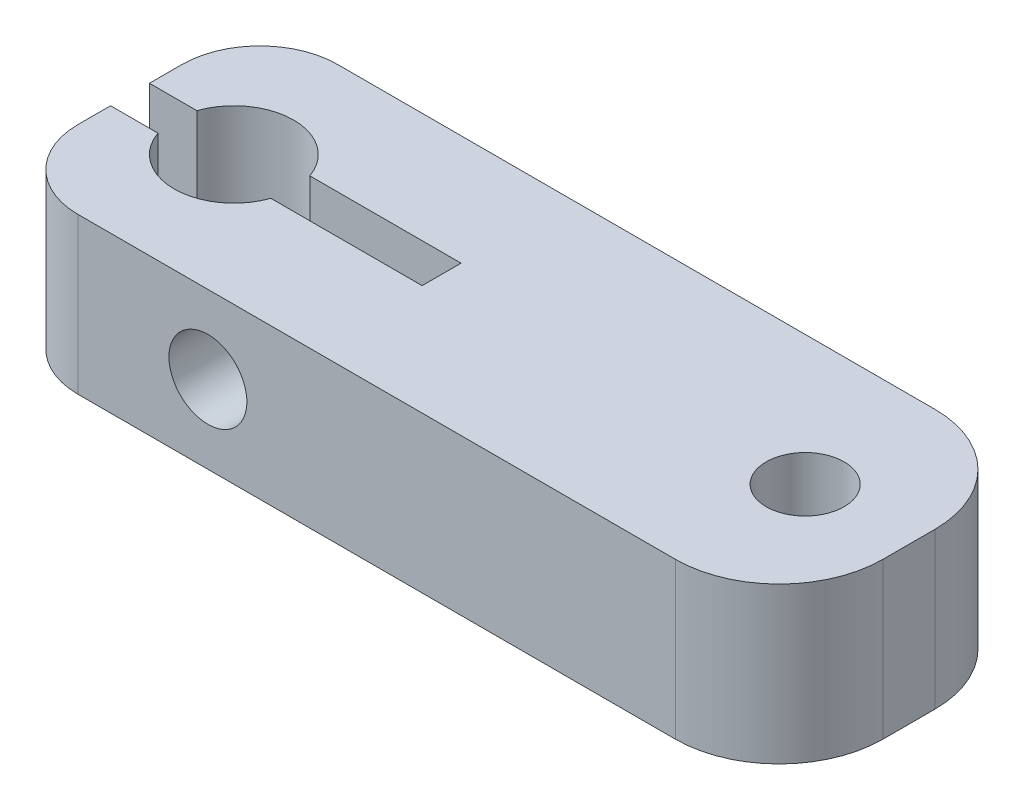
ISO-10303-21;
HEADER;
FILE_DESCRIPTION(('STEP AP214'),'2;1');
FILE_NAME('part.step','',(''),(''),'','','');
FILE_SCHEMA(('AUTOMOTIVE_DESIGN { 1 0 10303 214 1 1 1 1 }'));
ENDSEC;
DATA;
#1=APPLICATION_CONTEXT('core data for automotive mechanical design processes');
#2=APPLICATION_PROTOCOL_DEFINITION('international standard','automotive_design',2000,#1);
#3=PRODUCT_CONTEXT('',#1,'mechanical');
#4=PRODUCT('Part','Part','',(#3));
#5=PRODUCT_RELATED_PRODUCT_CATEGORY('part','',(#4));
#6=PRODUCT_DEFINITION_FORMATION('','',#4);
#7=PRODUCT_DEFINITION_CONTEXT('part definition',#1,'design');
#8=PRODUCT_DEFINITION('design','',#6,#7);
#9=PRODUCT_DEFINITION_SHAPE('','',#8);
#10=(LENGTH_UNIT() NAMED_UNIT(*) SI_UNIT(.MILLI.,.METRE.));
#11=(NAMED_UNIT(*) PLANE_ANGLE_UNIT() SI_UNIT($,.RADIAN.));
#12=(NAMED_UNIT(*) SI_UNIT($,.STERADIAN.) SOLID_ANGLE_UNIT());
#13=UNCERTAINTY_MEASURE_WITH_UNIT(LENGTH_MEASURE(1.E-05),#10,'distance_accuracy_value','');
#14=(GEOMETRIC_REPRESENTATION_CONTEXT(3) GLOBAL_UNCERTAINTY_ASSIGNED_CONTEXT((#13)) GLOBAL_UNIT_ASSIGNED_CONTEXT((#10,
#11,#12)) REPRESENTATION_CONTEXT('',''));
#15=CARTESIAN_POINT('',(0.,0.,0.));
#16=DIRECTION('',(0.,0.,1.));
#17=DIRECTION('',(1.,0.,0.));
#18=AXIS2_PLACEMENT_3D('',#15,#16,#17);
#19=CARTESIAN_POINT('',(-4.01717079102174,3.,-7.30912329358011));
#20=DIRECTION('',(0.,0.,-1.));
#21=DIRECTION('',(-1.,0.,0.));
#22=AXIS2_PLACEMENT_3D('',#19,#20,#21);
#23=CYLINDRICAL_SURFACE('',#22,1.5);
#24=CARTESIAN_POINT('',(-4.01717079102174,3.,-11.5601232935801));
#25=DIRECTION('',(0.,0.,1.));
#26=DIRECTION('',(1.,0.,0.));
#27=AXIS2_PLACEMENT_3D('',#24,#25,#26);
#28=CIRCLE('',#27,1.5);
#29=CARTESIAN_POINT('',(-2.51717079102175,3.,-11.5601232935801));
#30=VERTEX_POINT('',#29);
#31=EDGE_CURVE('E165',#30,#30,#28,.T.);
#32=ORIENTED_EDGE('',*,*,#31,.F.);
#33=EDGE_LOOP('',(#32));
#34=FACE_BOUND('',#33,.T.);
#35=CARTESIAN_POINT('',(-4.01717079102174,3.,-7.31012329358011));
#36=DIRECTION('',(0.,0.,-1.));
#37=DIRECTION('',(-1.,0.,0.));
#38=AXIS2_PLACEMENT_3D('',#35,#36,#37);
#39=CIRCLE('',#38,1.5);
#40=CARTESIAN_POINT('',(-5.51717079102174,3.,-7.31012329358011));
#41=VERTEX_POINT('',#40);
#42=EDGE_CURVE('E309',#41,#41,#39,.F.);
#43=ORIENTED_EDGE('',*,*,#42,.T.);
#44=EDGE_LOOP('',(#43));
#45=FACE_BOUND('',#44,.T.);
#46=ADVANCED_FACE('F41',(#34,#45),#23,.F.);
#47=CARTESIAN_POINT('',(-12.0171707910217,6.,-17.3101232935801));
#48=DIRECTION('',(1.,0.,0.));
#49=DIRECTION('',(0.,0.,-1.));
#50=AXIS2_PLACEMENT_3D('',#47,#48,#49);
#51=PLANE('',#50);
#52=DIRECTION('',(0.,0.,1.));
#53=VECTOR('',#52,1.);
#54=CARTESIAN_POINT('',(-12.0171707910217,0.,-17.3101232935801));
#55=LINE('',#54,#53);
#56=CARTESIAN_POINT('',(-12.0171707910217,0.,-14.3101232935801));
#57=VERTEX_POINT('',#56);
#58=CARTESIAN_POINT('',(-12.0171707910217,0.,-13.0601232935801));
#59=VERTEX_POINT('',#58);
#60=EDGE_CURVE('E206',#57,#59,#55,.T.);
#61=ORIENTED_EDGE('',*,*,#60,.T.);
#62=DIRECTION('',(0.,1.,0.));
#63=VECTOR('',#62,1.);
#64=CARTESIAN_POINT('',(-12.0171707910217,-0.00100000000000013,-13.0601232935801));
#65=LINE('',#64,#63);
#66=CARTESIAN_POINT('',(-12.0171707910217,6.,-13.0601232935801));
#67=VERTEX_POINT('',#66);
#68=EDGE_CURVE('E294',#59,#67,#65,.T.);
#69=ORIENTED_EDGE('',*,*,#68,.T.);
#70=DIRECTION('',(0.,0.,1.));
#71=VECTOR('',#70,1.);
#72=CARTESIAN_POINT('',(-12.0171707910217,6.,-17.3101232935801));
#73=LINE('',#72,#71);
#74=CARTESIAN_POINT('',(-12.0171707910217,6.,-14.3101232935801));
#75=VERTEX_POINT('',#74);
#76=EDGE_CURVE('E193',#75,#67,#73,.T.);
#77=ORIENTED_EDGE('',*,*,#76,.F.);
#78=DIRECTION('',(0.,-1.,0.));
#79=VECTOR('',#78,1.);
#80=CARTESIAN_POINT('',(-12.0171707910217,6.,-14.3101232935801));
#81=LINE('',#80,#79);
#82=EDGE_CURVE('E245',#75,#57,#81,.T.);
#83=ORIENTED_EDGE('',*,*,#82,.T.);
#84=EDGE_LOOP('',(#61,#69,#77,#83));
#85=FACE_BOUND('',#84,.T.);
#86=ADVANCED_FACE('F292',(#85),#51,.F.);
#87=CARTESIAN_POINT('',(-8.01717079102174,6.,-12.3101232935801));
#88=DIRECTION('',(0.,-1.,0.));
#89=DIRECTION('',(0.,0.,-1.));
#90=AXIS2_PLACEMENT_3D('',#87,#88,#89);
#91=CYLINDRICAL_SURFACE('',#90,2.3);
#92=DIRECTION('',(0.,-1.,0.));
#93=VECTOR('',#92,1.);
#94=CARTESIAN_POINT('',(-5.84288930050585,6.,-11.5601232935801));
#95=LINE('',#94,#93);
#96=CARTESIAN_POINT('',(-5.84288930050585,6.,-11.5601232935801));
#97=VERTEX_POINT('',#96);
#98=CARTESIAN_POINT('',(-5.84288930050585,0.,-11.5601232935801));
#99=VERTEX_POINT('',#98);
#100=EDGE_CURVE('E159',#97,#99,#95,.T.);
#101=ORIENTED_EDGE('',*,*,#100,.T.);
#102=CARTESIAN_POINT('',(-8.01717079102174,0.,-12.3101232935801));
#103=DIRECTION('',(0.,1.,0.));
#104=DIRECTION('',(0.,0.,1.));
#105=AXIS2_PLACEMENT_3D('',#102,#103,#104);
#106=CIRCLE('',#105,2.3);
#107=CARTESIAN_POINT('',(-10.1914522815376,0.,-11.5601232935801));
#108=VERTEX_POINT('',#107);
#109=EDGE_CURVE('E172',#108,#99,#106,.T.);
#110=ORIENTED_EDGE('',*,*,#109,.F.);
#111=DIRECTION('',(0.,-1.,0.));
#112=VECTOR('',#111,1.);
#113=CARTESIAN_POINT('',(-10.1914522815376,6.,-11.5601232935801));
#114=LINE('',#113,#112);
#115=CARTESIAN_POINT('',(-10.1914522815376,6.,-11.5601232935801));
#116=VERTEX_POINT('',#115);
#117=EDGE_CURVE('E298',#108,#116,#114,.F.);
#118=ORIENTED_EDGE('',*,*,#117,.T.);
#119=CARTESIAN_POINT('',(-8.01717079102174,6.,-12.3101232935801));
#120=DIRECTION('',(0.,1.,0.));
#121=DIRECTION('',(0.,0.,1.));
#122=AXIS2_PLACEMENT_3D('',#119,#120,#121);
#123=CIRCLE('',#122,2.3);
#124=EDGE_CURVE('E174',#116,#97,#123,.T.);
#125=ORIENTED_EDGE('',*,*,#124,.T.);
#126=EDGE_LOOP('',(#101,#110,#118,#125));
#127=FACE_BOUND('',#126,.T.);
#128=ADVANCED_FACE('F171',(#127),#91,.F.);
#129=CARTESIAN_POINT('',(-4.01717079102174,3.,-13.0601232935801));
#130=DIRECTION('',(0.,0.,-1.));
#131=DIRECTION('',(-1.,0.,0.));
#132=AXIS2_PLACEMENT_3D('',#129,#130,#131);
#133=CIRCLE('',#132,1.5);
#134=CARTESIAN_POINT('',(-5.51717079102174,3.,-13.0601232935801));
#135=VERTEX_POINT('',#134);
#136=EDGE_CURVE('E308',#135,#135,#133,.T.);
#137=ORIENTED_EDGE('',*,*,#136,.F.);
#138=EDGE_LOOP('',(#137));
#139=FACE_BOUND('',#138,.T.);
#140=CARTESIAN_POINT('',(-4.01717079102174,3.,-14.3101232935801));
#141=DIRECTION('',(0.,0.,-1.));
#142=DIRECTION('',(-1.,0.,0.));
#143=AXIS2_PLACEMENT_3D('',#140,#141,#142);
#144=CIRCLE('',#143,1.5);
#145=CARTESIAN_POINT('',(-5.51717079102174,3.,-14.3101232935801));
#146=VERTEX_POINT('',#145);
#147=EDGE_CURVE('E45',#146,#146,#144,.F.);
#148=ORIENTED_EDGE('',*,*,#147,.F.);
#149=EDGE_LOOP('',(#148));
#150=FACE_BOUND('',#149,.T.);
#151=ADVANCED_FACE('F330',(#139,#150),#23,.F.);
#152=CARTESIAN_POINT('',(0.,6.,0.));
#153=DIRECTION('',(0.,1.,0.));
#154=DIRECTION('',(0.,0.,1.));
#155=AXIS2_PLACEMENT_3D('',#152,#153,#154);
#156=PLANE('',#155);
#157=DIRECTION('',(1.,0.,0.));
#158=VECTOR('',#157,1.);
#159=CARTESIAN_POINT('',(-12.0171707910217,6.,-11.5601232935801));
#160=LINE('',#159,#158);
#161=CARTESIAN_POINT('',(-0.0171707910217433,6.,-11.5601232935801));
#162=VERTEX_POINT('',#161);
#163=EDGE_CURVE('E520',#97,#162,#160,.T.);
#164=ORIENTED_EDGE('',*,*,#163,.F.);
#165=ORIENTED_EDGE('',*,*,#124,.F.);
#166=DIRECTION('',(1.,0.,0.));
#167=VECTOR('',#166,1.);
#168=CARTESIAN_POINT('',(-12.0171707910217,6.,-11.5601232935801));
#169=LINE('',#168,#167);
#170=CARTESIAN_POINT('',(-12.0171707910217,6.,-11.5601232935801));
#171=VERTEX_POINT('',#170);
#172=EDGE_CURVE('E65',#171,#116,#169,.T.);
#173=ORIENTED_EDGE('',*,*,#172,.F.);
#174=CARTESIAN_POINT('',(-12.0171707910217,6.,-10.3101232935801));
#175=VERTEX_POINT('',#174);
#176=EDGE_CURVE('E197',#171,#175,#73,.T.);
#177=ORIENTED_EDGE('',*,*,#176,.T.);
#178=CARTESIAN_POINT('',(-9.01717079102175,6.,-10.3101232935801));
#179=DIRECTION('',(0.,1.,0.));
#180=DIRECTION('',(0.,0.,1.));
#181=AXIS2_PLACEMENT_3D('',#178,#179,#180);
#182=CIRCLE('',#181,3.);
#183=CARTESIAN_POINT('',(-9.01717079102175,6.,-7.31012329358011));
#184=VERTEX_POINT('',#183);
#185=EDGE_CURVE('E50',#175,#184,#182,.T.);
#186=ORIENTED_EDGE('',*,*,#185,.T.);
#187=DIRECTION('',(1.,0.,0.));
#188=VECTOR('',#187,1.);
#189=CARTESIAN_POINT('',(-12.0171707910217,6.,-7.31012329358011));
#190=LINE('',#189,#188);
#191=CARTESIAN_POINT('',(13.9828292089783,6.,-7.31012329358011));
#192=VERTEX_POINT('',#191);
#193=EDGE_CURVE('E196',#184,#192,#190,.T.);
#194=ORIENTED_EDGE('',*,*,#193,.T.);
#195=CARTESIAN_POINT('',(13.9828292089783,6.,-11.3101232935801));
#196=DIRECTION('',(0.,1.,0.));
#197=DIRECTION('',(0.,0.,1.));
#198=AXIS2_PLACEMENT_3D('',#195,#196,#197);
#199=CIRCLE('',#198,4.);
#200=CARTESIAN_POINT('',(17.9828292089783,6.,-11.3101232935801));
#201=VERTEX_POINT('',#200);
#202=EDGE_CURVE('E230',#192,#201,#199,.T.);
#203=ORIENTED_EDGE('',*,*,#202,.T.);
#204=DIRECTION('',(0.,0.,-1.));
#205=VECTOR('',#204,1.);
#206=CARTESIAN_POINT('',(17.9828292089783,6.,-17.3101232935801));
#207=LINE('',#206,#205);
#208=CARTESIAN_POINT('',(17.9828292089783,6.,-13.3101232935801));
#209=VERTEX_POINT('',#208);
#210=EDGE_CURVE('E199',#201,#209,#207,.T.);
#211=ORIENTED_EDGE('',*,*,#210,.T.);
#212=CARTESIAN_POINT('',(13.9828292089783,6.,-13.3101232935801));
#213=DIRECTION('',(0.,1.,0.));
#214=DIRECTION('',(0.,0.,1.));
#215=AXIS2_PLACEMENT_3D('',#212,#213,#214);
#216=CIRCLE('',#215,4.);
#217=CARTESIAN_POINT('',(13.9828292089783,6.,-17.3101232935801));
#218=VERTEX_POINT('',#217);
#219=EDGE_CURVE('E232',#209,#218,#216,.T.);
#220=ORIENTED_EDGE('',*,*,#219,.T.);
#221=DIRECTION('',(-1.,0.,0.));
#222=VECTOR('',#221,1.);
#223=CARTESIAN_POINT('',(-12.0171707910217,6.,-17.3101232935801));
#224=LINE('',#223,#222);
#225=CARTESIAN_POINT('',(-9.01717079102174,6.,-17.3101232935801));
#226=VERTEX_POINT('',#225);
#227=EDGE_CURVE('E202',#218,#226,#224,.T.);
#228=ORIENTED_EDGE('',*,*,#227,.T.);
#229=CARTESIAN_POINT('',(-9.01717079102174,6.,-14.3101232935801));
#230=DIRECTION('',(0.,1.,0.));
#231=DIRECTION('',(0.,0.,1.));
#232=AXIS2_PLACEMENT_3D('',#229,#230,#231);
#233=CIRCLE('',#232,3.);
#234=EDGE_CURVE('E251',#226,#75,#233,.T.);
#235=ORIENTED_EDGE('',*,*,#234,.T.);
#236=ORIENTED_EDGE('',*,*,#76,.T.);
#237=DIRECTION('',(-1.,0.,0.));
#238=VECTOR('',#237,1.);
#239=CARTESIAN_POINT('',(-12.0171707910217,6.,-13.0601232935801));
#240=LINE('',#239,#238);
#241=CARTESIAN_POINT('',(-10.1914522815376,6.,-13.0601232935801));
#242=VERTEX_POINT('',#241);
#243=EDGE_CURVE('E530',#242,#67,#240,.T.);
#244=ORIENTED_EDGE('',*,*,#243,.F.);
#245=CARTESIAN_POINT('',(-5.84288930050585,6.,-13.0601232935801));
#246=VERTEX_POINT('',#245);
#247=EDGE_CURVE('E534',#246,#242,#123,.T.);
#248=ORIENTED_EDGE('',*,*,#247,.F.);
#249=DIRECTION('',(-1.,0.,0.));
#250=VECTOR('',#249,1.);
#251=CARTESIAN_POINT('',(-12.0171707910217,6.,-13.0601232935801));
#252=LINE('',#251,#250);
#253=CARTESIAN_POINT('',(-0.0171707910217433,6.,-13.0601232935801));
#254=VERTEX_POINT('',#253);
#255=EDGE_CURVE('E525',#254,#246,#252,.T.);
#256=ORIENTED_EDGE('',*,*,#255,.F.);
#257=DIRECTION('',(0.,0.,-1.));
#258=VECTOR('',#257,1.);
#259=CARTESIAN_POINT('',(-0.0171707910217433,6.,-13.0601232935801));
#260=LINE('',#259,#258);
#261=EDGE_CURVE('E522',#162,#254,#260,.T.);
#262=ORIENTED_EDGE('',*,*,#261,.F.);
#263=EDGE_LOOP('',(#164,#165,#173,#177,#186,#194,#203,#211,#220,#228,#235,#236,#244,#248,#256,#262));
#264=FACE_BOUND('',#263,.T.);
#265=CARTESIAN_POINT('',(13.9828292089783,6.,-12.3101232935801));
#266=DIRECTION('',(0.,1.,0.));
#267=DIRECTION('',(0.,0.,1.));
#268=AXIS2_PLACEMENT_3D('',#265,#266,#267);
#269=CIRCLE('',#268,1.5);
#270=CARTESIAN_POINT('',(13.9828292089783,6.,-10.8101232935801));
#271=VERTEX_POINT('',#270);
#272=EDGE_CURVE('E184',#271,#271,#269,.T.);
#273=ORIENTED_EDGE('',*,*,#272,.F.);
#274=EDGE_LOOP('',(#273));
#275=FACE_BOUND('',#274,.T.);
#276=ADVANCED_FACE('F256',(#264,#275),#156,.T.);
#277=CARTESIAN_POINT('',(0.,0.,0.));
#278=DIRECTION('',(0.,1.,0.));
#279=DIRECTION('',(0.,0.,1.));
#280=AXIS2_PLACEMENT_3D('',#277,#278,#279);
#281=PLANE('',#280);
#282=ORIENTED_EDGE('',*,*,#109,.T.);
#283=DIRECTION('',(-1.,0.,0.));
#284=VECTOR('',#283,1.);
#285=CARTESIAN_POINT('',(-12.0171707910217,0.,-11.5601232935801));
#286=LINE('',#285,#284);
#287=CARTESIAN_POINT('',(-0.0171707910217433,0.,-11.5601232935801));
#288=VERTEX_POINT('',#287);
#289=EDGE_CURVE('E154',#288,#99,#286,.T.);
#290=ORIENTED_EDGE('',*,*,#289,.F.);
#291=DIRECTION('',(0.,0.,1.));
#292=VECTOR('',#291,1.);
#293=CARTESIAN_POINT('',(-0.0171707910217433,0.,-13.0601232935801));
#294=LINE('',#293,#292);
#295=CARTESIAN_POINT('',(-0.0171707910217433,0.,-13.0601232935801));
#296=VERTEX_POINT('',#295);
#297=EDGE_CURVE('E541',#296,#288,#294,.T.);
#298=ORIENTED_EDGE('',*,*,#297,.F.);
#299=DIRECTION('',(1.,0.,0.));
#300=VECTOR('',#299,1.);
#301=CARTESIAN_POINT('',(-12.0171707910217,0.,-13.0601232935801));
#302=LINE('',#301,#300);
#303=CARTESIAN_POINT('',(-5.84288930050585,0.,-13.0601232935801));
#304=VERTEX_POINT('',#303);
#305=EDGE_CURVE('E512',#304,#296,#302,.T.);
#306=ORIENTED_EDGE('',*,*,#305,.F.);
#307=CARTESIAN_POINT('',(-10.1914522815376,0.,-13.0601232935801));
#308=VERTEX_POINT('',#307);
#309=EDGE_CURVE('E183',#304,#308,#106,.T.);
#310=ORIENTED_EDGE('',*,*,#309,.T.);
#311=DIRECTION('',(1.,0.,0.));
#312=VECTOR('',#311,1.);
#313=CARTESIAN_POINT('',(-12.0171707910217,0.,-13.0601232935801));
#314=LINE('',#313,#312);
#315=EDGE_CURVE('E57',#59,#308,#314,.T.);
#316=ORIENTED_EDGE('',*,*,#315,.F.);
#317=ORIENTED_EDGE('',*,*,#60,.F.);
#318=CARTESIAN_POINT('',(-9.01717079102174,0.,-14.3101232935801));
#319=DIRECTION('',(0.,1.,0.));
#320=DIRECTION('',(0.,0.,1.));
#321=AXIS2_PLACEMENT_3D('',#318,#319,#320);
#322=CIRCLE('',#321,3.);
#323=CARTESIAN_POINT('',(-9.01717079102174,0.,-17.3101232935801));
#324=VERTEX_POINT('',#323);
#325=EDGE_CURVE('E240',#57,#324,#322,.F.);
#326=ORIENTED_EDGE('',*,*,#325,.T.);
#327=DIRECTION('',(-1.,0.,0.));
#328=VECTOR('',#327,1.);
#329=CARTESIAN_POINT('',(-12.0171707910217,0.,-17.3101232935801));
#330=LINE('',#329,#328);
#331=CARTESIAN_POINT('',(13.9828292089783,0.,-17.3101232935801));
#332=VERTEX_POINT('',#331);
#333=EDGE_CURVE('E215',#332,#324,#330,.T.);
#334=ORIENTED_EDGE('',*,*,#333,.F.);
#335=CARTESIAN_POINT('',(13.9828292089783,0.,-13.3101232935801));
#336=DIRECTION('',(0.,1.,0.));
#337=DIRECTION('',(0.,0.,1.));
#338=AXIS2_PLACEMENT_3D('',#335,#336,#337);
#339=CIRCLE('',#338,4.);
#340=CARTESIAN_POINT('',(17.9828292089783,0.,-13.3101232935801));
#341=VERTEX_POINT('',#340);
#342=EDGE_CURVE('E223',#332,#341,#339,.F.);
#343=ORIENTED_EDGE('',*,*,#342,.T.);
#344=DIRECTION('',(0.,0.,-1.));
#345=VECTOR('',#344,1.);
#346=CARTESIAN_POINT('',(17.9828292089783,0.,-17.3101232935801));
#347=LINE('',#346,#345);
#348=CARTESIAN_POINT('',(17.9828292089783,0.,-11.3101232935801));
#349=VERTEX_POINT('',#348);
#350=EDGE_CURVE('E212',#349,#341,#347,.T.);
#351=ORIENTED_EDGE('',*,*,#350,.F.);
#352=CARTESIAN_POINT('',(13.9828292089783,0.,-11.3101232935801));
#353=DIRECTION('',(0.,1.,0.));
#354=DIRECTION('',(0.,0.,1.));
#355=AXIS2_PLACEMENT_3D('',#352,#353,#354);
#356=CIRCLE('',#355,4.);
#357=CARTESIAN_POINT('',(13.9828292089783,0.,-7.31012329358011));
#358=VERTEX_POINT('',#357);
#359=EDGE_CURVE('E220',#349,#358,#356,.F.);
#360=ORIENTED_EDGE('',*,*,#359,.T.);
#361=DIRECTION('',(1.,0.,0.));
#362=VECTOR('',#361,1.);
#363=CARTESIAN_POINT('',(-12.0171707910217,0.,-7.31012329358011));
#364=LINE('',#363,#362);
#365=CARTESIAN_POINT('',(-9.01717079102175,0.,-7.31012329358011));
#366=VERTEX_POINT('',#365);
#367=EDGE_CURVE('E209',#366,#358,#364,.T.);
#368=ORIENTED_EDGE('',*,*,#367,.F.);
#369=CARTESIAN_POINT('',(-9.01717079102175,0.,-10.3101232935801));
#370=DIRECTION('',(0.,1.,0.));
#371=DIRECTION('',(0.,0.,1.));
#372=AXIS2_PLACEMENT_3D('',#369,#370,#371);
#373=CIRCLE('',#372,3.);
#374=CARTESIAN_POINT('',(-12.0171707910217,0.,-10.3101232935801));
#375=VERTEX_POINT('',#374);
#376=EDGE_CURVE('E242',#366,#375,#373,.F.);
#377=ORIENTED_EDGE('',*,*,#376,.T.);
#378=CARTESIAN_POINT('',(-12.0171707910217,0.,-11.5601232935801));
#379=VERTEX_POINT('',#378);
#380=EDGE_CURVE('E210',#379,#375,#55,.T.);
#381=ORIENTED_EDGE('',*,*,#380,.F.);
#382=DIRECTION('',(-1.,0.,0.));
#383=VECTOR('',#382,1.);
#384=CARTESIAN_POINT('',(-12.0171707910217,0.,-11.5601232935801));
#385=LINE('',#384,#383);
#386=EDGE_CURVE('E182',#108,#379,#385,.T.);
#387=ORIENTED_EDGE('',*,*,#386,.F.);
#388=EDGE_LOOP('',(#282,#290,#298,#306,#310,#316,#317,#326,#334,#343,#351,#360,#368,#377,#381,#387));
#389=FACE_BOUND('',#388,.T.);
#390=CARTESIAN_POINT('',(13.9828292089783,0.,-12.3101232935801));
#391=DIRECTION('',(0.,1.,0.));
#392=DIRECTION('',(0.,0.,1.));
#393=AXIS2_PLACEMENT_3D('',#390,#391,#392);
#394=CIRCLE('',#393,1.5);
#395=CARTESIAN_POINT('',(13.9828292089783,0.,-10.8101232935801));
#396=VERTEX_POINT('',#395);
#397=EDGE_CURVE('E188',#396,#396,#394,.T.);
#398=ORIENTED_EDGE('',*,*,#397,.T.);
#399=EDGE_LOOP('',(#398));
#400=FACE_BOUND('',#399,.T.);
#401=ADVANCED_FACE('F179',(#389,#400),#281,.F.);
#402=ORIENTED_EDGE('',*,*,#176,.F.);
#403=DIRECTION('',(0.,1.,0.));
#404=VECTOR('',#403,1.);
#405=CARTESIAN_POINT('',(-12.0171707910217,-0.00100000000000013,-11.5601232935801));
#406=LINE('',#405,#404);
#407=EDGE_CURVE('E176',#379,#171,#406,.T.);
#408=ORIENTED_EDGE('',*,*,#407,.F.);
#409=ORIENTED_EDGE('',*,*,#380,.T.);
#410=DIRECTION('',(0.,-1.,0.));
#411=VECTOR('',#410,1.);
#412=CARTESIAN_POINT('',(-12.0171707910217,6.,-10.3101232935801));
#413=LINE('',#412,#411);
#414=EDGE_CURVE('E248',#375,#175,#413,.F.);
#415=ORIENTED_EDGE('',*,*,#414,.T.);
#416=EDGE_LOOP('',(#402,#408,#409,#415));
#417=FACE_BOUND('',#416,.T.);
#418=ADVANCED_FACE('F336',(#417),#51,.F.);
#419=CARTESIAN_POINT('',(-12.0171707910217,6.,-7.31012329358011));
#420=DIRECTION('',(0.,0.,-1.));
#421=DIRECTION('',(-1.,0.,0.));
#422=AXIS2_PLACEMENT_3D('',#419,#420,#421);
#423=PLANE('',#422);
#424=ORIENTED_EDGE('',*,*,#42,.F.);
#425=EDGE_LOOP('',(#424));
#426=FACE_BOUND('',#425,.T.);
#427=ORIENTED_EDGE('',*,*,#193,.F.);
#428=DIRECTION('',(0.,-1.,0.));
#429=VECTOR('',#428,1.);
#430=CARTESIAN_POINT('',(-9.01717079102175,6.,-7.31012329358011));
#431=LINE('',#430,#429);
#432=EDGE_CURVE('E237',#184,#366,#431,.T.);
#433=ORIENTED_EDGE('',*,*,#432,.T.);
#434=ORIENTED_EDGE('',*,*,#367,.T.);
#435=DIRECTION('',(0.,-1.,0.));
#436=VECTOR('',#435,1.);
#437=CARTESIAN_POINT('',(13.9828292089783,6.,-7.31012329358011));
#438=LINE('',#437,#436);
#439=EDGE_CURVE('E234',#358,#192,#438,.F.);
#440=ORIENTED_EDGE('',*,*,#439,.T.);
#441=EDGE_LOOP('',(#427,#433,#434,#440));
#442=FACE_BOUND('',#441,.T.);
#443=ADVANCED_FACE('F263',(#426,#442),#423,.F.);
#444=CARTESIAN_POINT('',(17.9828292089783,6.,-17.3101232935801));
#445=DIRECTION('',(-1.,0.,0.));
#446=DIRECTION('',(0.,0.,1.));
#447=AXIS2_PLACEMENT_3D('',#444,#445,#446);
#448=PLANE('',#447);
#449=ORIENTED_EDGE('',*,*,#350,.T.);
#450=DIRECTION('',(0.,-1.,0.));
#451=VECTOR('',#450,1.);
#452=CARTESIAN_POINT('',(17.9828292089783,6.,-13.3101232935801));
#453=LINE('',#452,#451);
#454=EDGE_CURVE('E228',#341,#209,#453,.F.);
#455=ORIENTED_EDGE('',*,*,#454,.T.);
#456=ORIENTED_EDGE('',*,*,#210,.F.);
#457=DIRECTION('',(0.,-1.,0.));
#458=VECTOR('',#457,1.);
#459=CARTESIAN_POINT('',(17.9828292089783,6.,-11.3101232935801));
#460=LINE('',#459,#458);
#461=EDGE_CURVE('E225',#201,#349,#460,.T.);
#462=ORIENTED_EDGE('',*,*,#461,.T.);
#463=EDGE_LOOP('',(#449,#455,#456,#462));
#464=FACE_BOUND('',#463,.T.);
#465=ADVANCED_FACE('F275',(#464),#448,.F.);
#466=CARTESIAN_POINT('',(-12.0171707910217,6.,-17.3101232935801));
#467=DIRECTION('',(0.,0.,1.));
#468=DIRECTION('',(1.,0.,0.));
#469=AXIS2_PLACEMENT_3D('',#466,#467,#468);
#470=PLANE('',#469);
#471=CARTESIAN_POINT('',(-4.01717079102174,3.,-17.3101232935801));
#472=DIRECTION('',(0.,0.,-1.));
#473=DIRECTION('',(-1.,0.,0.));
#474=AXIS2_PLACEMENT_3D('',#471,#472,#473);
#475=CIRCLE('',#474,2.5);
#476=CARTESIAN_POINT('',(-6.51717079102174,3.,-17.3101232935801));
#477=VERTEX_POINT('',#476);
#478=EDGE_CURVE('E305',#477,#477,#475,.T.);
#479=ORIENTED_EDGE('',*,*,#478,.F.);
#480=EDGE_LOOP('',(#479));
#481=FACE_BOUND('',#480,.T.);
#482=ORIENTED_EDGE('',*,*,#333,.T.);
#483=DIRECTION('',(0.,-1.,0.));
#484=VECTOR('',#483,1.);
#485=CARTESIAN_POINT('',(-9.01717079102174,6.,-17.3101232935801));
#486=LINE('',#485,#484);
#487=EDGE_CURVE('E11',#324,#226,#486,.F.);
#488=ORIENTED_EDGE('',*,*,#487,.T.);
#489=ORIENTED_EDGE('',*,*,#227,.F.);
#490=DIRECTION('',(0.,-1.,0.));
#491=VECTOR('',#490,1.);
#492=CARTESIAN_POINT('',(13.9828292089783,6.,-17.3101232935801));
#493=LINE('',#492,#491);
#494=EDGE_CURVE('E205',#218,#332,#493,.T.);
#495=ORIENTED_EDGE('',*,*,#494,.T.);
#496=EDGE_LOOP('',(#482,#488,#489,#495));
#497=FACE_BOUND('',#496,.T.);
#498=ADVANCED_FACE('F283',(#481,#497),#470,.F.);
#499=DIRECTION('',(0.,-1.,0.));
#500=VECTOR('',#499,1.);
#501=CARTESIAN_POINT('',(-5.84288930050586,6.,-13.0601232935801));
#502=LINE('',#501,#500);
#503=EDGE_CURVE('E175',#304,#246,#502,.F.);
#504=ORIENTED_EDGE('',*,*,#503,.T.);
#505=ORIENTED_EDGE('',*,*,#247,.T.);
#506=DIRECTION('',(0.,-1.,0.));
#507=VECTOR('',#506,1.);
#508=CARTESIAN_POINT('',(-10.1914522815376,6.,-13.0601232935801));
#509=LINE('',#508,#507);
#510=EDGE_CURVE('E295',#242,#308,#509,.T.);
#511=ORIENTED_EDGE('',*,*,#510,.T.);
#512=ORIENTED_EDGE('',*,*,#309,.F.);
#513=EDGE_LOOP('',(#504,#505,#511,#512));
#514=FACE_BOUND('',#513,.T.);
#515=ADVANCED_FACE('F316',(#514),#91,.F.);
#516=CARTESIAN_POINT('',(13.9828292089783,6.,-12.3101232935801));
#517=DIRECTION('',(0.,-1.,0.));
#518=DIRECTION('',(0.,0.,-1.));
#519=AXIS2_PLACEMENT_3D('',#516,#517,#518);
#520=CYLINDRICAL_SURFACE('',#519,1.5);
#521=ORIENTED_EDGE('',*,*,#272,.T.);
#522=EDGE_LOOP('',(#521));
#523=FACE_BOUND('',#522,.T.);
#524=ORIENTED_EDGE('',*,*,#397,.F.);
#525=EDGE_LOOP('',(#524));
#526=FACE_BOUND('',#525,.T.);
#527=ADVANCED_FACE('F314',(#523,#526),#520,.F.);
#528=CARTESIAN_POINT('',(13.9828292089783,6.,-13.3101232935801));
#529=DIRECTION('',(0.,-1.,0.));
#530=DIRECTION('',(0.,0.,-1.));
#531=AXIS2_PLACEMENT_3D('',#528,#529,#530);
#532=CYLINDRICAL_SURFACE('',#531,4.);
#533=ORIENTED_EDGE('',*,*,#219,.F.);
#534=ORIENTED_EDGE('',*,*,#454,.F.);
#535=ORIENTED_EDGE('',*,*,#342,.F.);
#536=ORIENTED_EDGE('',*,*,#494,.F.);
#537=EDGE_LOOP('',(#533,#534,#535,#536));
#538=FACE_BOUND('',#537,.T.);
#539=ADVANCED_FACE('F278',(#538),#532,.T.);
#540=CARTESIAN_POINT('',(13.9828292089783,6.,-11.3101232935801));
#541=DIRECTION('',(0.,-1.,0.));
#542=DIRECTION('',(0.,0.,-1.));
#543=AXIS2_PLACEMENT_3D('',#540,#541,#542);
#544=CYLINDRICAL_SURFACE('',#543,4.);
#545=ORIENTED_EDGE('',*,*,#202,.F.);
#546=ORIENTED_EDGE('',*,*,#439,.F.);
#547=ORIENTED_EDGE('',*,*,#359,.F.);
#548=ORIENTED_EDGE('',*,*,#461,.F.);
#549=EDGE_LOOP('',(#545,#546,#547,#548));
#550=FACE_BOUND('',#549,.T.);
#551=ADVANCED_FACE('F271',(#550),#544,.T.);
#552=CARTESIAN_POINT('',(-9.01717079102175,6.,-10.3101232935801));
#553=DIRECTION('',(0.,-1.,0.));
#554=DIRECTION('',(0.,0.,-1.));
#555=AXIS2_PLACEMENT_3D('',#552,#553,#554);
#556=CYLINDRICAL_SURFACE('',#555,3.);
#557=ORIENTED_EDGE('',*,*,#185,.F.);
#558=ORIENTED_EDGE('',*,*,#414,.F.);
#559=ORIENTED_EDGE('',*,*,#376,.F.);
#560=ORIENTED_EDGE('',*,*,#432,.F.);
#561=EDGE_LOOP('',(#557,#558,#559,#560));
#562=FACE_BOUND('',#561,.T.);
#563=ADVANCED_FACE('F267',(#562),#556,.T.);
#564=CARTESIAN_POINT('',(-9.01717079102174,6.,-14.3101232935801));
#565=DIRECTION('',(0.,-1.,0.));
#566=DIRECTION('',(0.,0.,-1.));
#567=AXIS2_PLACEMENT_3D('',#564,#565,#566);
#568=CYLINDRICAL_SURFACE('',#567,3.);
#569=ORIENTED_EDGE('',*,*,#234,.F.);
#570=ORIENTED_EDGE('',*,*,#487,.F.);
#571=ORIENTED_EDGE('',*,*,#325,.F.);
#572=ORIENTED_EDGE('',*,*,#82,.F.);
#573=EDGE_LOOP('',(#569,#570,#571,#572));
#574=FACE_BOUND('',#573,.T.);
#575=ADVANCED_FACE('F43',(#574),#568,.T.);
#576=CARTESIAN_POINT('',(-4.01717079102174,3.,-14.3101232935801));
#577=DIRECTION('',(0.,0.,-1.));
#578=DIRECTION('',(-1.,0.,0.));
#579=AXIS2_PLACEMENT_3D('',#576,#577,#578);
#580=PLANE('',#579);
#581=ORIENTED_EDGE('',*,*,#147,.T.);
#582=EDGE_LOOP('',(#581));
#583=FACE_BOUND('',#582,.T.);
#584=CARTESIAN_POINT('',(-4.01717079102174,3.,-14.3101232935801));
#585=DIRECTION('',(0.,0.,-1.));
#586=DIRECTION('',(-1.,0.,0.));
#587=AXIS2_PLACEMENT_3D('',#584,#585,#586);
#588=CIRCLE('',#587,2.5);
#589=CARTESIAN_POINT('',(-6.51717079102174,3.,-14.3101232935801));
#590=VERTEX_POINT('',#589);
#591=EDGE_CURVE('E302',#590,#590,#588,.T.);
#592=ORIENTED_EDGE('',*,*,#591,.T.);
#593=EDGE_LOOP('',(#592));
#594=FACE_BOUND('',#593,.T.);
#595=ADVANCED_FACE('F353',(#583,#594),#580,.T.);
#596=CARTESIAN_POINT('',(-4.01717079102174,3.,-14.3101232935801));
#597=DIRECTION('',(0.,0.,-1.));
#598=DIRECTION('',(-1.,0.,0.));
#599=AXIS2_PLACEMENT_3D('',#596,#597,#598);
#600=CYLINDRICAL_SURFACE('',#599,2.5);
#601=ORIENTED_EDGE('',*,*,#591,.F.);
#602=EDGE_LOOP('',(#601));
#603=FACE_BOUND('',#602,.T.);
#604=ORIENTED_EDGE('',*,*,#478,.T.);
#605=EDGE_LOOP('',(#604));
#606=FACE_BOUND('',#605,.T.);
#607=ADVANCED_FACE('F356',(#603,#606),#600,.F.);
#608=CARTESIAN_POINT('',(-12.0171707910217,-0.00100000000000013,-11.5601232935801));
#609=DIRECTION('',(0.,0.,1.));
#610=DIRECTION('',(1.,0.,0.));
#611=AXIS2_PLACEMENT_3D('',#608,#609,#610);
#612=PLANE('',#611);
#613=ORIENTED_EDGE('',*,*,#386,.T.);
#614=ORIENTED_EDGE('',*,*,#407,.T.);
#615=ORIENTED_EDGE('',*,*,#172,.T.);
#616=ORIENTED_EDGE('',*,*,#117,.F.);
#617=EDGE_LOOP('',(#613,#614,#615,#616));
#618=FACE_BOUND('',#617,.T.);
#619=ADVANCED_FACE('F360',(#618),#612,.F.);
#620=CARTESIAN_POINT('',(-12.0171707910217,-0.00100000000000013,-13.0601232935801));
#621=DIRECTION('',(0.,0.,-1.));
#622=DIRECTION('',(-1.,0.,0.));
#623=AXIS2_PLACEMENT_3D('',#620,#621,#622);
#624=PLANE('',#623);
#625=ORIENTED_EDGE('',*,*,#315,.T.);
#626=ORIENTED_EDGE('',*,*,#510,.F.);
#627=ORIENTED_EDGE('',*,*,#243,.T.);
#628=ORIENTED_EDGE('',*,*,#68,.F.);
#629=EDGE_LOOP('',(#625,#626,#627,#628));
#630=FACE_BOUND('',#629,.T.);
#631=ADVANCED_FACE('F470',(#630),#624,.F.);
#632=CARTESIAN_POINT('',(-12.0171707910217,-0.00100000000000013,-11.5601232935801));
#633=DIRECTION('',(0.,0.,1.));
#634=DIRECTION('',(1.,0.,0.));
#635=AXIS2_PLACEMENT_3D('',#632,#633,#634);
#636=PLANE('',#635);
#637=ORIENTED_EDGE('',*,*,#289,.T.);
#638=ORIENTED_EDGE('',*,*,#100,.F.);
#639=ORIENTED_EDGE('',*,*,#163,.T.);
#640=DIRECTION('',(0.,1.,0.));
#641=VECTOR('',#640,1.);
#642=CARTESIAN_POINT('',(-0.0171707910217433,-0.00100000000000013,-11.5601232935801));
#643=LINE('',#642,#641);
#644=EDGE_CURVE('E161',#288,#162,#643,.T.);
#645=ORIENTED_EDGE('',*,*,#644,.F.);
#646=EDGE_LOOP('',(#637,#638,#639,#645));
#647=FACE_BOUND('',#646,.T.);
#648=ORIENTED_EDGE('',*,*,#31,.T.);
#649=EDGE_LOOP('',(#648));
#650=FACE_BOUND('',#649,.T.);
#651=ADVANCED_FACE('F156',(#647,#650),#636,.F.);
#652=CARTESIAN_POINT('',(-0.0171707910217433,-0.00100000000000013,-13.0601232935801));
#653=DIRECTION('',(1.,0.,0.));
#654=DIRECTION('',(0.,0.,-1.));
#655=AXIS2_PLACEMENT_3D('',#652,#653,#654);
#656=PLANE('',#655);
#657=ORIENTED_EDGE('',*,*,#297,.T.);
#658=ORIENTED_EDGE('',*,*,#644,.T.);
#659=ORIENTED_EDGE('',*,*,#261,.T.);
#660=DIRECTION('',(0.,1.,0.));
#661=VECTOR('',#660,1.);
#662=CARTESIAN_POINT('',(-0.0171707910217433,-0.00100000000000013,-13.0601232935801));
#663=LINE('',#662,#661);
#664=EDGE_CURVE('E166',#296,#254,#663,.T.);
#665=ORIENTED_EDGE('',*,*,#664,.F.);
#666=EDGE_LOOP('',(#657,#658,#659,#665));
#667=FACE_BOUND('',#666,.T.);
#668=ADVANCED_FACE('F485',(#667),#656,.F.);
#669=CARTESIAN_POINT('',(-12.0171707910217,-0.00100000000000013,-13.0601232935801));
#670=DIRECTION('',(0.,0.,-1.));
#671=DIRECTION('',(-1.,0.,0.));
#672=AXIS2_PLACEMENT_3D('',#669,#670,#671);
#673=PLANE('',#672);
#674=ORIENTED_EDGE('',*,*,#305,.T.);
#675=ORIENTED_EDGE('',*,*,#664,.T.);
#676=ORIENTED_EDGE('',*,*,#255,.T.);
#677=ORIENTED_EDGE('',*,*,#503,.F.);
#678=EDGE_LOOP('',(#674,#675,#676,#677));
#679=FACE_BOUND('',#678,.T.);
#680=ORIENTED_EDGE('',*,*,#136,.T.);
#681=EDGE_LOOP('',(#680));
#682=FACE_BOUND('',#681,.T.);
#683=ADVANCED_FACE('F493',(#679,#682),#673,.F.);
#684=CLOSED_SHELL('',(#46,#86,#128,#151,#276,#401,#418,#443,#465,#498,#515,#527,#539,#551,#563,
#575,#595,#607,#619,#631,#651,#668,#683));
#685=MANIFOLD_SOLID_BREP('B2',#684);
#686=ADVANCED_BREP_SHAPE_REPRESENTATION('',(#18,#685),#14);
#687=SHAPE_DEFINITION_REPRESENTATION(#9,#686);
ENDSEC;
END-ISO-10303-21;
